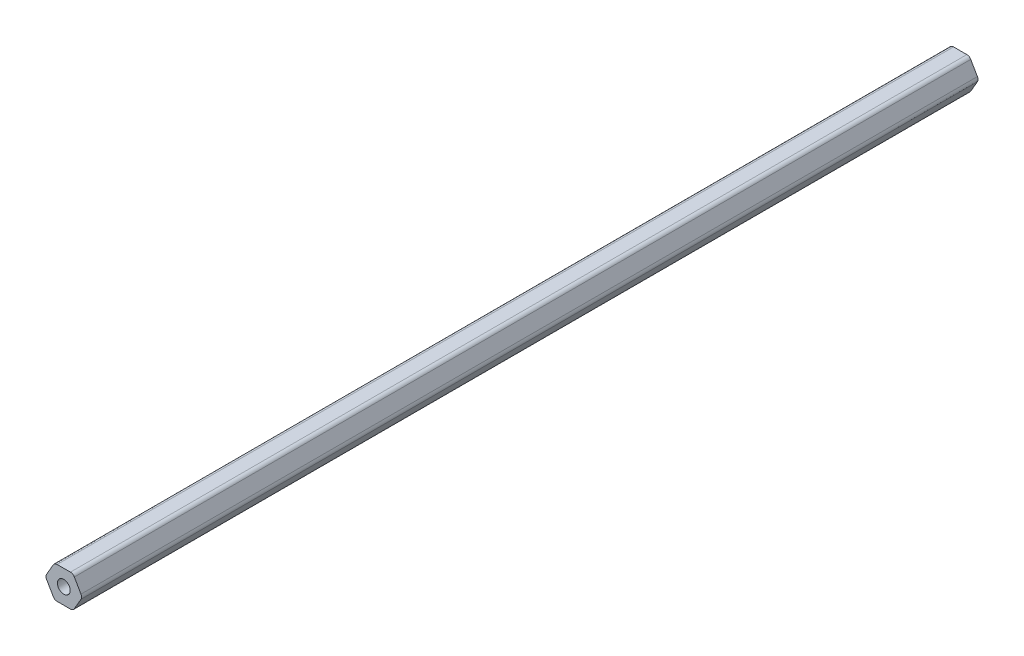
ISO-10303-21;
HEADER;
FILE_DESCRIPTION(('STEP AP214'),'2;1');
FILE_NAME('part.step','',(''),(''),'','','');
FILE_SCHEMA(('AUTOMOTIVE_DESIGN { 1 0 10303 214 1 1 1 1 }'));
ENDSEC;
DATA;
#1=APPLICATION_CONTEXT('core data for automotive mechanical design processes');
#2=APPLICATION_PROTOCOL_DEFINITION('international standard','automotive_design',2000,#1);
#3=PRODUCT_CONTEXT('',#1,'mechanical');
#4=PRODUCT('Part','Part','',(#3));
#5=PRODUCT_RELATED_PRODUCT_CATEGORY('part','',(#4));
#6=PRODUCT_DEFINITION_FORMATION('','',#4);
#7=PRODUCT_DEFINITION_CONTEXT('part definition',#1,'design');
#8=PRODUCT_DEFINITION('design','',#6,#7);
#9=PRODUCT_DEFINITION_SHAPE('','',#8);
#10=(LENGTH_UNIT() NAMED_UNIT(*) SI_UNIT(.MILLI.,.METRE.));
#11=(NAMED_UNIT(*) PLANE_ANGLE_UNIT() SI_UNIT($,.RADIAN.));
#12=(NAMED_UNIT(*) SI_UNIT($,.STERADIAN.) SOLID_ANGLE_UNIT());
#13=UNCERTAINTY_MEASURE_WITH_UNIT(LENGTH_MEASURE(1.E-05),#10,'distance_accuracy_value','');
#14=(GEOMETRIC_REPRESENTATION_CONTEXT(3) GLOBAL_UNCERTAINTY_ASSIGNED_CONTEXT((#13)) GLOBAL_UNIT_ASSIGNED_CONTEXT((#10,
#11,#12)) REPRESENTATION_CONTEXT('',''));
#15=CARTESIAN_POINT('',(0.,0.,0.));
#16=DIRECTION('',(0.,0.,1.));
#17=DIRECTION('',(1.,0.,0.));
#18=AXIS2_PLACEMENT_3D('',#15,#16,#17);
#19=CARTESIAN_POINT('',(0.,0.,355.6));
#20=DIRECTION('',(0.,0.,1.));
#21=DIRECTION('',(1.,0.,0.));
#22=AXIS2_PLACEMENT_3D('',#19,#20,#21);
#23=PLANE('',#22);
#24=DIRECTION('',(0.500000000000007,-0.866025403784434,0.));
#25=VECTOR('',#24,1.);
#26=CARTESIAN_POINT('',(-9.05968049811549,0.370142588444359,355.6));
#27=LINE('',#26,#25);
#28=CARTESIAN_POINT('',(-8.5464161088059,-0.51885741155564,355.6));
#29=VERTEX_POINT('',#28);
#30=CARTESIAN_POINT('',(-5.90677067807088,-5.09085741155563,355.6));
#31=VERTEX_POINT('',#30);
#32=EDGE_CURVE('E236',#29,#31,#27,.T.);
#33=ORIENTED_EDGE('',*,*,#32,.T.);
#34=CARTESIAN_POINT('',(-4.36697751014216,-4.20185741155562,355.6));
#35=DIRECTION('',(0.,0.,1.));
#36=DIRECTION('',(1.,0.,0.));
#37=AXIS2_PLACEMENT_3D('',#34,#35,#36);
#38=CIRCLE('',#37,1.778);
#39=CARTESIAN_POINT('',(-4.36697751014214,-5.97985741155562,355.6));
#40=VERTEX_POINT('',#39);
#41=EDGE_CURVE('E210',#31,#40,#38,.T.);
#42=ORIENTED_EDGE('',*,*,#41,.T.);
#43=DIRECTION('',(1.,0.,0.));
#44=VECTOR('',#43,1.);
#45=CARTESIAN_POINT('',(-5.3935062887613,-5.97985741155563,355.6));
#46=LINE('',#45,#44);
#47=CARTESIAN_POINT('',(0.912313351327819,-5.97985741155556,355.6));
#48=VERTEX_POINT('',#47);
#49=EDGE_CURVE('E155',#40,#48,#46,.T.);
#50=ORIENTED_EDGE('',*,*,#49,.T.);
#51=CARTESIAN_POINT('',(0.912313351327801,-4.20185741155556,355.6));
#52=DIRECTION('',(0.,0.,1.));
#53=DIRECTION('',(1.,0.,0.));
#54=AXIS2_PLACEMENT_3D('',#51,#52,#53);
#55=CIRCLE('',#54,1.778);
#56=CARTESIAN_POINT('',(2.45210651925654,-5.09085741155555,355.6));
#57=VERTEX_POINT('',#56);
#58=EDGE_CURVE('E207',#48,#57,#55,.T.);
#59=ORIENTED_EDGE('',*,*,#58,.T.);
#60=DIRECTION('',(0.499999999999995,0.866025403784441,0.));
#61=VECTOR('',#60,1.);
#62=CARTESIAN_POINT('',(1.93884212994697,-5.97985741155555,355.6));
#63=LINE('',#62,#61);
#64=CARTESIAN_POINT('',(5.09175194999145,-0.518857411555588,355.6));
#65=VERTEX_POINT('',#64);
#66=EDGE_CURVE('E164',#57,#65,#63,.T.);
#67=ORIENTED_EDGE('',*,*,#66,.T.);
#68=CARTESIAN_POINT('',(3.55195878206271,0.370142588444404,355.6));
#69=DIRECTION('',(0.,0.,1.));
#70=DIRECTION('',(1.,0.,0.));
#71=AXIS2_PLACEMENT_3D('',#68,#69,#70);
#72=CIRCLE('',#71,1.778);
#73=CARTESIAN_POINT('',(5.09175194999145,1.25914258844441,355.6));
#74=VERTEX_POINT('',#73);
#75=EDGE_CURVE('E204',#65,#74,#72,.T.);
#76=ORIENTED_EDGE('',*,*,#75,.T.);
#77=DIRECTION('',(-0.500000000000001,0.866025403784438,0.));
#78=VECTOR('',#77,1.);
#79=CARTESIAN_POINT('',(5.60501633930102,0.37014258844441,355.6));
#80=LINE('',#79,#78);
#81=CARTESIAN_POINT('',(2.45210651925646,5.83114258844442,355.6));
#82=VERTEX_POINT('',#81);
#83=EDGE_CURVE('E170',#74,#82,#80,.T.);
#84=ORIENTED_EDGE('',*,*,#83,.T.);
#85=CARTESIAN_POINT('',(0.912313351327729,4.94214258844442,355.6));
#86=DIRECTION('',(0.,0.,1.));
#87=DIRECTION('',(1.,0.,0.));
#88=AXIS2_PLACEMENT_3D('',#85,#86,#87);
#89=CIRCLE('',#88,1.778);
#90=CARTESIAN_POINT('',(0.912313351327723,6.72014258844442,355.6));
#91=VERTEX_POINT('',#90);
#92=EDGE_CURVE('E201',#82,#91,#89,.T.);
#93=ORIENTED_EDGE('',*,*,#92,.T.);
#94=DIRECTION('',(-1.,0.,0.));
#95=VECTOR('',#94,1.);
#96=CARTESIAN_POINT('',(1.93884212994688,6.72014258844442,355.6));
#97=LINE('',#96,#95);
#98=CARTESIAN_POINT('',(-4.36697751014223,6.7201425884444,355.6));
#99=VERTEX_POINT('',#98);
#100=EDGE_CURVE('E243',#91,#99,#97,.T.);
#101=ORIENTED_EDGE('',*,*,#100,.T.);
#102=CARTESIAN_POINT('',(-4.36697751014222,4.9421425884444,355.6));
#103=DIRECTION('',(0.,0.,1.));
#104=DIRECTION('',(1.,0.,0.));
#105=AXIS2_PLACEMENT_3D('',#102,#103,#104);
#106=CIRCLE('',#105,1.778);
#107=CARTESIAN_POINT('',(-5.90677067807096,5.83114258844439,355.6));
#108=VERTEX_POINT('',#107);
#109=EDGE_CURVE('E65',#99,#108,#106,.T.);
#110=ORIENTED_EDGE('',*,*,#109,.T.);
#111=DIRECTION('',(-0.499999999999995,-0.866025403784441,0.));
#112=VECTOR('',#111,1.);
#113=CARTESIAN_POINT('',(-5.39350628876139,6.7201425884444,355.6));
#114=LINE('',#113,#112);
#115=CARTESIAN_POINT('',(-8.54641610880591,1.25914258844436,355.6));
#116=VERTEX_POINT('',#115);
#117=EDGE_CURVE('E240',#108,#116,#114,.T.);
#118=ORIENTED_EDGE('',*,*,#117,.T.);
#119=CARTESIAN_POINT('',(-7.00662294087717,0.370142588444373,355.6));
#120=DIRECTION('',(0.,0.,1.));
#121=DIRECTION('',(1.,0.,0.));
#122=AXIS2_PLACEMENT_3D('',#119,#120,#121);
#123=CIRCLE('',#122,1.778);
#124=EDGE_CURVE('E196',#116,#29,#123,.T.);
#125=ORIENTED_EDGE('',*,*,#124,.T.);
#126=EDGE_LOOP('',(#33,#42,#50,#59,#67,#76,#84,#93,#101,#110,#118,#125));
#127=FACE_BOUND('',#126,.T.);
#128=CARTESIAN_POINT('',(-1.72733207940723,0.37014258844441,355.6));
#129=DIRECTION('',(0.,0.,1.));
#130=DIRECTION('',(1.,0.,0.));
#131=AXIS2_PLACEMENT_3D('',#128,#129,#130);
#132=CIRCLE('',#131,2.54);
#133=CARTESIAN_POINT('',(0.812667920592769,0.37014258844441,355.6));
#134=VERTEX_POINT('',#133);
#135=EDGE_CURVE('E258',#134,#134,#132,.T.);
#136=ORIENTED_EDGE('',*,*,#135,.F.);
#137=EDGE_LOOP('',(#136));
#138=FACE_BOUND('',#137,.T.);
#139=ADVANCED_FACE('F43',(#127,#138),#23,.T.);
#140=CARTESIAN_POINT('',(0.,0.,0.));
#141=DIRECTION('',(0.,0.,1.));
#142=DIRECTION('',(1.,0.,0.));
#143=AXIS2_PLACEMENT_3D('',#140,#141,#142);
#144=PLANE('',#143);
#145=DIRECTION('',(1.,0.,0.));
#146=VECTOR('',#145,1.);
#147=CARTESIAN_POINT('',(-5.3935062887613,-5.97985741155563,0.));
#148=LINE('',#147,#146);
#149=CARTESIAN_POINT('',(-4.36697751014214,-5.97985741155562,0.));
#150=VERTEX_POINT('',#149);
#151=CARTESIAN_POINT('',(0.912313351327819,-5.97985741155556,0.));
#152=VERTEX_POINT('',#151);
#153=EDGE_CURVE('E152',#150,#152,#148,.T.);
#154=ORIENTED_EDGE('',*,*,#153,.F.);
#155=CARTESIAN_POINT('',(-4.36697751014216,-4.20185741155562,0.));
#156=DIRECTION('',(0.,0.,1.));
#157=DIRECTION('',(1.,0.,0.));
#158=AXIS2_PLACEMENT_3D('',#155,#156,#157);
#159=CIRCLE('',#158,1.778);
#160=CARTESIAN_POINT('',(-5.90677067807088,-5.09085741155563,0.));
#161=VERTEX_POINT('',#160);
#162=EDGE_CURVE('E134',#150,#161,#159,.F.);
#163=ORIENTED_EDGE('',*,*,#162,.T.);
#164=DIRECTION('',(0.500000000000007,-0.866025403784434,0.));
#165=VECTOR('',#164,1.);
#166=CARTESIAN_POINT('',(-9.05968049811549,0.370142588444359,0.));
#167=LINE('',#166,#165);
#168=CARTESIAN_POINT('',(-8.5464161088059,-0.51885741155564,0.));
#169=VERTEX_POINT('',#168);
#170=EDGE_CURVE('E165',#169,#161,#167,.T.);
#171=ORIENTED_EDGE('',*,*,#170,.F.);
#172=CARTESIAN_POINT('',(-7.00662294087717,0.370142588444373,0.));
#173=DIRECTION('',(0.,0.,1.));
#174=DIRECTION('',(1.,0.,0.));
#175=AXIS2_PLACEMENT_3D('',#172,#173,#174);
#176=CIRCLE('',#175,1.778);
#177=CARTESIAN_POINT('',(-8.54641610880591,1.25914258844436,0.));
#178=VERTEX_POINT('',#177);
#179=EDGE_CURVE('E157',#169,#178,#176,.F.);
#180=ORIENTED_EDGE('',*,*,#179,.T.);
#181=DIRECTION('',(-0.499999999999995,-0.866025403784441,0.));
#182=VECTOR('',#181,1.);
#183=CARTESIAN_POINT('',(-5.39350628876139,6.7201425884444,0.));
#184=LINE('',#183,#182);
#185=CARTESIAN_POINT('',(-5.90677067807096,5.83114258844439,0.));
#186=VERTEX_POINT('',#185);
#187=EDGE_CURVE('E172',#186,#178,#184,.T.);
#188=ORIENTED_EDGE('',*,*,#187,.F.);
#189=CARTESIAN_POINT('',(-4.36697751014222,4.9421425884444,0.));
#190=DIRECTION('',(0.,0.,1.));
#191=DIRECTION('',(1.,0.,0.));
#192=AXIS2_PLACEMENT_3D('',#189,#190,#191);
#193=CIRCLE('',#192,1.778);
#194=CARTESIAN_POINT('',(-4.36697751014223,6.7201425884444,0.));
#195=VERTEX_POINT('',#194);
#196=EDGE_CURVE('E180',#186,#195,#193,.F.);
#197=ORIENTED_EDGE('',*,*,#196,.T.);
#198=DIRECTION('',(-1.,0.,0.));
#199=VECTOR('',#198,1.);
#200=CARTESIAN_POINT('',(1.93884212994688,6.72014258844442,0.));
#201=LINE('',#200,#199);
#202=CARTESIAN_POINT('',(0.912313351327723,6.72014258844442,0.));
#203=VERTEX_POINT('',#202);
#204=EDGE_CURVE('E262',#203,#195,#201,.T.);
#205=ORIENTED_EDGE('',*,*,#204,.F.);
#206=CARTESIAN_POINT('',(0.912313351327729,4.94214258844442,0.));
#207=DIRECTION('',(0.,0.,1.));
#208=DIRECTION('',(1.,0.,0.));
#209=AXIS2_PLACEMENT_3D('',#206,#207,#208);
#210=CIRCLE('',#209,1.778);
#211=CARTESIAN_POINT('',(2.45210651925646,5.83114258844442,0.));
#212=VERTEX_POINT('',#211);
#213=EDGE_CURVE('E183',#203,#212,#210,.F.);
#214=ORIENTED_EDGE('',*,*,#213,.T.);
#215=DIRECTION('',(-0.500000000000001,0.866025403784438,0.));
#216=VECTOR('',#215,1.);
#217=CARTESIAN_POINT('',(5.60501633930102,0.37014258844441,0.));
#218=LINE('',#217,#216);
#219=CARTESIAN_POINT('',(5.09175194999145,1.25914258844441,0.));
#220=VERTEX_POINT('',#219);
#221=EDGE_CURVE('E257',#220,#212,#218,.T.);
#222=ORIENTED_EDGE('',*,*,#221,.F.);
#223=CARTESIAN_POINT('',(3.55195878206271,0.370142588444404,0.));
#224=DIRECTION('',(0.,0.,1.));
#225=DIRECTION('',(1.,0.,0.));
#226=AXIS2_PLACEMENT_3D('',#223,#224,#225);
#227=CIRCLE('',#226,1.778);
#228=CARTESIAN_POINT('',(5.09175194999145,-0.518857411555588,0.));
#229=VERTEX_POINT('',#228);
#230=EDGE_CURVE('E186',#220,#229,#227,.F.);
#231=ORIENTED_EDGE('',*,*,#230,.T.);
#232=DIRECTION('',(0.499999999999995,0.866025403784441,0.));
#233=VECTOR('',#232,1.);
#234=CARTESIAN_POINT('',(1.93884212994697,-5.97985741155555,0.));
#235=LINE('',#234,#233);
#236=CARTESIAN_POINT('',(2.45210651925654,-5.09085741155555,0.));
#237=VERTEX_POINT('',#236);
#238=EDGE_CURVE('E253',#237,#229,#235,.T.);
#239=ORIENTED_EDGE('',*,*,#238,.F.);
#240=CARTESIAN_POINT('',(0.912313351327801,-4.20185741155556,0.));
#241=DIRECTION('',(0.,0.,1.));
#242=DIRECTION('',(1.,0.,0.));
#243=AXIS2_PLACEMENT_3D('',#240,#241,#242);
#244=CIRCLE('',#243,1.778);
#245=EDGE_CURVE('E146',#237,#152,#244,.F.);
#246=ORIENTED_EDGE('',*,*,#245,.T.);
#247=EDGE_LOOP('',(#154,#163,#171,#180,#188,#197,#205,#214,#222,#231,#239,#246));
#248=FACE_BOUND('',#247,.T.);
#249=CARTESIAN_POINT('',(-1.72733207940723,0.37014258844441,0.));
#250=DIRECTION('',(0.,0.,1.));
#251=DIRECTION('',(1.,0.,0.));
#252=AXIS2_PLACEMENT_3D('',#249,#250,#251);
#253=CIRCLE('',#252,2.54);
#254=CARTESIAN_POINT('',(0.812667920592769,0.37014258844441,0.));
#255=VERTEX_POINT('',#254);
#256=EDGE_CURVE('E306',#255,#255,#253,.T.);
#257=ORIENTED_EDGE('',*,*,#256,.T.);
#258=EDGE_LOOP('',(#257));
#259=FACE_BOUND('',#258,.T.);
#260=ADVANCED_FACE('F160',(#248,#259),#144,.F.);
#261=CARTESIAN_POINT('',(1.93884212994697,-5.97985741155555,355.6));
#262=DIRECTION('',(-0.866025403784442,0.499999999999995,0.));
#263=DIRECTION('',(-0.499999999999995,-0.866025403784442,0.));
#264=AXIS2_PLACEMENT_3D('',#261,#262,#263);
#265=PLANE('',#264);
#266=ORIENTED_EDGE('',*,*,#66,.F.);
#267=DIRECTION('',(0.,0.,-1.));
#268=VECTOR('',#267,1.);
#269=CARTESIAN_POINT('',(2.45210651925654,-5.09085741155555,355.6));
#270=LINE('',#269,#268);
#271=EDGE_CURVE('E216',#57,#237,#270,.T.);
#272=ORIENTED_EDGE('',*,*,#271,.T.);
#273=ORIENTED_EDGE('',*,*,#238,.T.);
#274=DIRECTION('',(0.,0.,-1.));
#275=VECTOR('',#274,1.);
#276=CARTESIAN_POINT('',(5.09175194999145,-0.518857411555588,355.6));
#277=LINE('',#276,#275);
#278=EDGE_CURVE('E213',#229,#65,#277,.F.);
#279=ORIENTED_EDGE('',*,*,#278,.T.);
#280=EDGE_LOOP('',(#266,#272,#273,#279));
#281=FACE_BOUND('',#280,.T.);
#282=ADVANCED_FACE('F291',(#281),#265,.F.);
#283=CARTESIAN_POINT('',(5.60501633930102,0.37014258844441,355.6));
#284=DIRECTION('',(-0.866025403784438,-0.500000000000001,0.));
#285=DIRECTION('',(0.500000000000001,-0.866025403784438,0.));
#286=AXIS2_PLACEMENT_3D('',#283,#284,#285);
#287=PLANE('',#286);
#288=ORIENTED_EDGE('',*,*,#83,.F.);
#289=DIRECTION('',(0.,0.,-1.));
#290=VECTOR('',#289,1.);
#291=CARTESIAN_POINT('',(5.09175194999145,1.25914258844441,355.6));
#292=LINE('',#291,#290);
#293=EDGE_CURVE('E223',#74,#220,#292,.T.);
#294=ORIENTED_EDGE('',*,*,#293,.T.);
#295=ORIENTED_EDGE('',*,*,#221,.T.);
#296=DIRECTION('',(0.,0.,-1.));
#297=VECTOR('',#296,1.);
#298=CARTESIAN_POINT('',(2.45210651925646,5.83114258844442,355.6));
#299=LINE('',#298,#297);
#300=EDGE_CURVE('E220',#212,#82,#299,.F.);
#301=ORIENTED_EDGE('',*,*,#300,.T.);
#302=EDGE_LOOP('',(#288,#294,#295,#301));
#303=FACE_BOUND('',#302,.T.);
#304=ADVANCED_FACE('F339',(#303),#287,.F.);
#305=CARTESIAN_POINT('',(1.93884212994688,6.72014258844442,355.6));
#306=DIRECTION('',(0.,-1.,0.));
#307=DIRECTION('',(1.,0.,0.));
#308=AXIS2_PLACEMENT_3D('',#305,#306,#307);
#309=PLANE('',#308);
#310=ORIENTED_EDGE('',*,*,#100,.F.);
#311=DIRECTION('',(0.,0.,-1.));
#312=VECTOR('',#311,1.);
#313=CARTESIAN_POINT('',(0.912313351327723,6.72014258844442,355.6));
#314=LINE('',#313,#312);
#315=EDGE_CURVE('E230',#91,#203,#314,.T.);
#316=ORIENTED_EDGE('',*,*,#315,.T.);
#317=ORIENTED_EDGE('',*,*,#204,.T.);
#318=DIRECTION('',(0.,0.,-1.));
#319=VECTOR('',#318,1.);
#320=CARTESIAN_POINT('',(-4.36697751014223,6.7201425884444,355.6));
#321=LINE('',#320,#319);
#322=EDGE_CURVE('E227',#195,#99,#321,.F.);
#323=ORIENTED_EDGE('',*,*,#322,.T.);
#324=EDGE_LOOP('',(#310,#316,#317,#323));
#325=FACE_BOUND('',#324,.T.);
#326=ADVANCED_FACE('F284',(#325),#309,.F.);
#327=CARTESIAN_POINT('',(-5.39350628876139,6.7201425884444,355.6));
#328=DIRECTION('',(0.866025403784441,-0.499999999999995,0.));
#329=DIRECTION('',(0.499999999999995,0.866025403784441,0.));
#330=AXIS2_PLACEMENT_3D('',#327,#328,#329);
#331=PLANE('',#330);
#332=ORIENTED_EDGE('',*,*,#117,.F.);
#333=DIRECTION('',(0.,0.,-1.));
#334=VECTOR('',#333,1.);
#335=CARTESIAN_POINT('',(-5.90677067807096,5.83114258844439,355.6));
#336=LINE('',#335,#334);
#337=EDGE_CURVE('E11',#108,#186,#336,.T.);
#338=ORIENTED_EDGE('',*,*,#337,.T.);
#339=ORIENTED_EDGE('',*,*,#187,.T.);
#340=DIRECTION('',(0.,0.,-1.));
#341=VECTOR('',#340,1.);
#342=CARTESIAN_POINT('',(-8.54641610880591,1.25914258844437,355.6));
#343=LINE('',#342,#341);
#344=EDGE_CURVE('E52',#178,#116,#343,.F.);
#345=ORIENTED_EDGE('',*,*,#344,.T.);
#346=EDGE_LOOP('',(#332,#338,#339,#345));
#347=FACE_BOUND('',#346,.T.);
#348=ADVANCED_FACE('F267',(#347),#331,.F.);
#349=CARTESIAN_POINT('',(-9.05968049811549,0.370142588444359,355.6));
#350=DIRECTION('',(0.866025403784434,0.500000000000007,0.));
#351=DIRECTION('',(-0.500000000000007,0.866025403784434,0.));
#352=AXIS2_PLACEMENT_3D('',#349,#350,#351);
#353=PLANE('',#352);
#354=ORIENTED_EDGE('',*,*,#170,.T.);
#355=DIRECTION('',(0.,0.,-1.));
#356=VECTOR('',#355,1.);
#357=CARTESIAN_POINT('',(-5.90677067807088,-5.09085741155563,355.6));
#358=LINE('',#357,#356);
#359=EDGE_CURVE('E139',#161,#31,#358,.F.);
#360=ORIENTED_EDGE('',*,*,#359,.T.);
#361=ORIENTED_EDGE('',*,*,#32,.F.);
#362=DIRECTION('',(0.,0.,-1.));
#363=VECTOR('',#362,1.);
#364=CARTESIAN_POINT('',(-8.5464161088059,-0.51885741155564,355.6));
#365=LINE('',#364,#363);
#366=EDGE_CURVE('E145',#29,#169,#365,.T.);
#367=ORIENTED_EDGE('',*,*,#366,.T.);
#368=EDGE_LOOP('',(#354,#360,#361,#367));
#369=FACE_BOUND('',#368,.T.);
#370=ADVANCED_FACE('F275',(#369),#353,.F.);
#371=CARTESIAN_POINT('',(-5.3935062887613,-5.97985741155563,355.6));
#372=DIRECTION('',(0.,1.,0.));
#373=DIRECTION('',(-1.,0.,0.));
#374=AXIS2_PLACEMENT_3D('',#371,#372,#373);
#375=PLANE('',#374);
#376=ORIENTED_EDGE('',*,*,#49,.F.);
#377=DIRECTION('',(0.,0.,-1.));
#378=VECTOR('',#377,1.);
#379=CARTESIAN_POINT('',(-4.36697751014214,-5.97985741155562,355.6));
#380=LINE('',#379,#378);
#381=EDGE_CURVE('E138',#40,#150,#380,.T.);
#382=ORIENTED_EDGE('',*,*,#381,.T.);
#383=ORIENTED_EDGE('',*,*,#153,.T.);
#384=DIRECTION('',(0.,0.,-1.));
#385=VECTOR('',#384,1.);
#386=CARTESIAN_POINT('',(0.912313351327819,-5.97985741155556,355.6));
#387=LINE('',#386,#385);
#388=EDGE_CURVE('E158',#152,#48,#387,.F.);
#389=ORIENTED_EDGE('',*,*,#388,.T.);
#390=EDGE_LOOP('',(#376,#382,#383,#389));
#391=FACE_BOUND('',#390,.T.);
#392=ADVANCED_FACE('F151',(#391),#375,.F.);
#393=CARTESIAN_POINT('',(-1.72733207940723,0.37014258844441,355.6));
#394=DIRECTION('',(0.,0.,-1.));
#395=DIRECTION('',(-1.,0.,0.));
#396=AXIS2_PLACEMENT_3D('',#393,#394,#395);
#397=CYLINDRICAL_SURFACE('',#396,2.54);
#398=ORIENTED_EDGE('',*,*,#135,.T.);
#399=EDGE_LOOP('',(#398));
#400=FACE_BOUND('',#399,.T.);
#401=ORIENTED_EDGE('',*,*,#256,.F.);
#402=EDGE_LOOP('',(#401));
#403=FACE_BOUND('',#402,.T.);
#404=ADVANCED_FACE('F282',(#400,#403),#397,.F.);
#405=CARTESIAN_POINT('',(-4.36697751014216,-4.20185741155562,355.6));
#406=DIRECTION('',(0.,0.,-1.));
#407=DIRECTION('',(-1.,0.,0.));
#408=AXIS2_PLACEMENT_3D('',#405,#406,#407);
#409=CYLINDRICAL_SURFACE('',#408,1.778);
#410=ORIENTED_EDGE('',*,*,#41,.F.);
#411=ORIENTED_EDGE('',*,*,#359,.F.);
#412=ORIENTED_EDGE('',*,*,#162,.F.);
#413=ORIENTED_EDGE('',*,*,#381,.F.);
#414=EDGE_LOOP('',(#410,#411,#412,#413));
#415=FACE_BOUND('',#414,.T.);
#416=ADVANCED_FACE('F137',(#415),#409,.T.);
#417=CARTESIAN_POINT('',(0.912313351327801,-4.20185741155556,355.6));
#418=DIRECTION('',(0.,0.,-1.));
#419=DIRECTION('',(-1.,0.,0.));
#420=AXIS2_PLACEMENT_3D('',#417,#418,#419);
#421=CYLINDRICAL_SURFACE('',#420,1.778);
#422=ORIENTED_EDGE('',*,*,#58,.F.);
#423=ORIENTED_EDGE('',*,*,#388,.F.);
#424=ORIENTED_EDGE('',*,*,#245,.F.);
#425=ORIENTED_EDGE('',*,*,#271,.F.);
#426=EDGE_LOOP('',(#422,#423,#424,#425));
#427=FACE_BOUND('',#426,.T.);
#428=ADVANCED_FACE('F299',(#427),#421,.T.);
#429=CARTESIAN_POINT('',(3.55195878206271,0.370142588444404,355.6));
#430=DIRECTION('',(0.,0.,-1.));
#431=DIRECTION('',(-1.,0.,0.));
#432=AXIS2_PLACEMENT_3D('',#429,#430,#431);
#433=CYLINDRICAL_SURFACE('',#432,1.778);
#434=ORIENTED_EDGE('',*,*,#75,.F.);
#435=ORIENTED_EDGE('',*,*,#278,.F.);
#436=ORIENTED_EDGE('',*,*,#230,.F.);
#437=ORIENTED_EDGE('',*,*,#293,.F.);
#438=EDGE_LOOP('',(#434,#435,#436,#437));
#439=FACE_BOUND('',#438,.T.);
#440=ADVANCED_FACE('F313',(#439),#433,.T.);
#441=CARTESIAN_POINT('',(0.912313351327729,4.94214258844442,355.6));
#442=DIRECTION('',(0.,0.,-1.));
#443=DIRECTION('',(-1.,0.,0.));
#444=AXIS2_PLACEMENT_3D('',#441,#442,#443);
#445=CYLINDRICAL_SURFACE('',#444,1.778);
#446=ORIENTED_EDGE('',*,*,#92,.F.);
#447=ORIENTED_EDGE('',*,*,#300,.F.);
#448=ORIENTED_EDGE('',*,*,#213,.F.);
#449=ORIENTED_EDGE('',*,*,#315,.F.);
#450=EDGE_LOOP('',(#446,#447,#448,#449));
#451=FACE_BOUND('',#450,.T.);
#452=ADVANCED_FACE('F321',(#451),#445,.T.);
#453=CARTESIAN_POINT('',(-4.36697751014222,4.9421425884444,355.6));
#454=DIRECTION('',(0.,0.,-1.));
#455=DIRECTION('',(-1.,0.,0.));
#456=AXIS2_PLACEMENT_3D('',#453,#454,#455);
#457=CYLINDRICAL_SURFACE('',#456,1.778);
#458=ORIENTED_EDGE('',*,*,#109,.F.);
#459=ORIENTED_EDGE('',*,*,#322,.F.);
#460=ORIENTED_EDGE('',*,*,#196,.F.);
#461=ORIENTED_EDGE('',*,*,#337,.F.);
#462=EDGE_LOOP('',(#458,#459,#460,#461));
#463=FACE_BOUND('',#462,.T.);
#464=ADVANCED_FACE('F324',(#463),#457,.T.);
#465=CARTESIAN_POINT('',(-7.00662294087717,0.370142588444373,355.6));
#466=DIRECTION('',(0.,0.,-1.));
#467=DIRECTION('',(-1.,0.,0.));
#468=AXIS2_PLACEMENT_3D('',#465,#466,#467);
#469=CYLINDRICAL_SURFACE('',#468,1.778);
#470=ORIENTED_EDGE('',*,*,#124,.F.);
#471=ORIENTED_EDGE('',*,*,#344,.F.);
#472=ORIENTED_EDGE('',*,*,#179,.F.);
#473=ORIENTED_EDGE('',*,*,#366,.F.);
#474=EDGE_LOOP('',(#470,#471,#472,#473));
#475=FACE_BOUND('',#474,.T.);
#476=ADVANCED_FACE('F45',(#475),#469,.T.);
#477=CLOSED_SHELL('',(#139,#260,#282,#304,#326,#348,#370,#392,#404,#416,#428,#440,#452,#464,#476));
#478=MANIFOLD_SOLID_BREP('B2',#477);
#479=ADVANCED_BREP_SHAPE_REPRESENTATION('',(#18,#478),#14);
#480=SHAPE_DEFINITION_REPRESENTATION(#9,#479);
ENDSEC;
END-ISO-10303-21;
